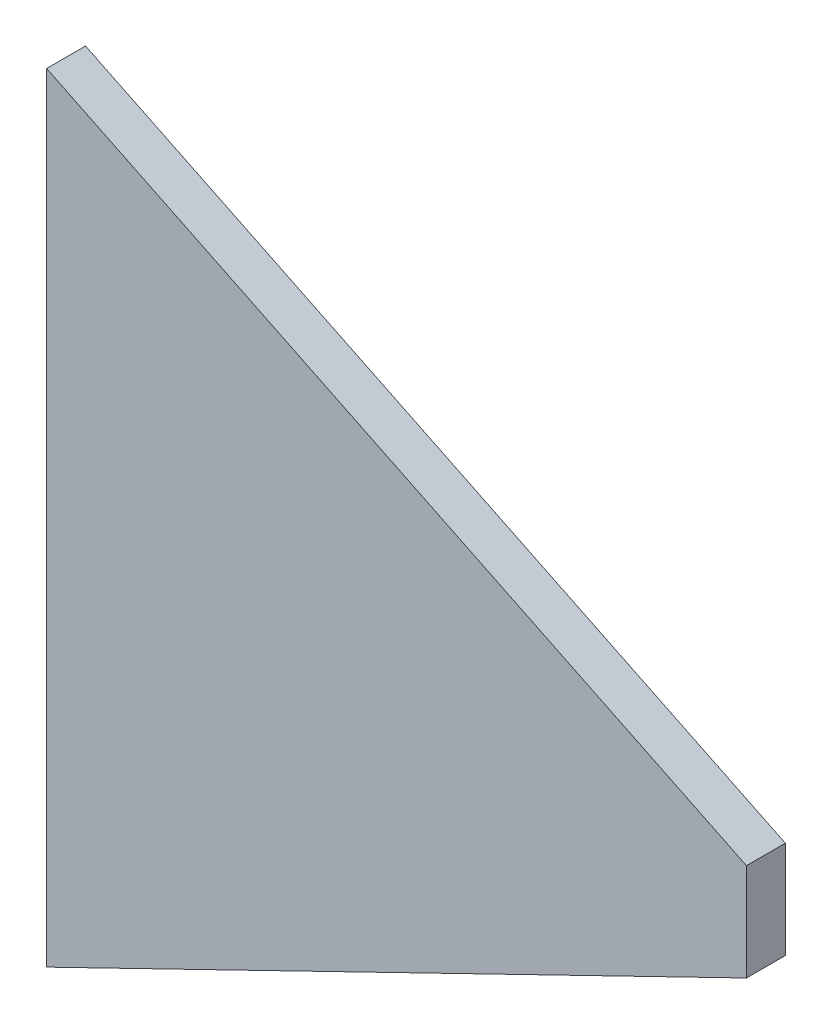
ISO-10303-21;
HEADER;
FILE_DESCRIPTION(('STEP AP214'),'2;1');
FILE_NAME('part.step','',(''),(''),'','','');
FILE_SCHEMA(('AUTOMOTIVE_DESIGN { 1 0 10303 214 1 1 1 1 }'));
ENDSEC;
DATA;
#1=APPLICATION_CONTEXT('core data for automotive mechanical design processes');
#2=APPLICATION_PROTOCOL_DEFINITION('international standard','automotive_design',2000,#1);
#3=PRODUCT_CONTEXT('',#1,'mechanical');
#4=PRODUCT('Part','Part','',(#3));
#5=PRODUCT_RELATED_PRODUCT_CATEGORY('part','',(#4));
#6=PRODUCT_DEFINITION_FORMATION('','',#4);
#7=PRODUCT_DEFINITION_CONTEXT('part definition',#1,'design');
#8=PRODUCT_DEFINITION('design','',#6,#7);
#9=PRODUCT_DEFINITION_SHAPE('','',#8);
#10=(LENGTH_UNIT() NAMED_UNIT(*) SI_UNIT(.MILLI.,.METRE.));
#11=(NAMED_UNIT(*) PLANE_ANGLE_UNIT() SI_UNIT($,.RADIAN.));
#12=(NAMED_UNIT(*) SI_UNIT($,.STERADIAN.) SOLID_ANGLE_UNIT());
#13=UNCERTAINTY_MEASURE_WITH_UNIT(LENGTH_MEASURE(1.E-05),#10,'distance_accuracy_value','');
#14=(GEOMETRIC_REPRESENTATION_CONTEXT(3) GLOBAL_UNCERTAINTY_ASSIGNED_CONTEXT((#13)) GLOBAL_UNIT_ASSIGNED_CONTEXT((#10,
#11,#12)) REPRESENTATION_CONTEXT('',''));
#15=CARTESIAN_POINT('',(0.,0.,0.));
#16=DIRECTION('',(0.,0.,1.));
#17=DIRECTION('',(1.,0.,0.));
#18=AXIS2_PLACEMENT_3D('',#15,#16,#17);
#19=CARTESIAN_POINT('',(-22.8401476297768,-11.1125,1.27));
#20=DIRECTION('',(-0.4375,0.899218410621135,0.));
#21=DIRECTION('',(-0.899218410621135,-0.4375,0.));
#22=AXIS2_PLACEMENT_3D('',#19,#20,#21);
#23=PLANE('',#22);
#24=DIRECTION('',(0.899218410621135,0.4375,0.));
#25=VECTOR('',#24,1.);
#26=CARTESIAN_POINT('',(-22.8401476297768,-11.1125,0.));
#27=LINE('',#26,#25);
#28=CARTESIAN_POINT('',(-22.8401476297768,-11.1125,0.));
#29=VERTEX_POINT('',#28);
#30=CARTESIAN_POINT('',(0.,0.,0.));
#31=VERTEX_POINT('',#30);
#32=EDGE_CURVE('E96',#29,#31,#27,.T.);
#33=ORIENTED_EDGE('',*,*,#32,.T.);
#34=DIRECTION('',(0.,0.,-1.));
#35=VECTOR('',#34,1.);
#36=CARTESIAN_POINT('',(0.,0.,1.27));
#37=LINE('',#36,#35);
#38=CARTESIAN_POINT('',(0.,0.,1.27));
#39=VERTEX_POINT('',#38);
#40=EDGE_CURVE('E11',#39,#31,#37,.T.);
#41=ORIENTED_EDGE('',*,*,#40,.F.);
#42=DIRECTION('',(0.899218410621135,0.4375,0.));
#43=VECTOR('',#42,1.);
#44=CARTESIAN_POINT('',(-22.8401476297768,-11.1125,1.27));
#45=LINE('',#44,#43);
#46=CARTESIAN_POINT('',(-22.8401476297768,-11.1125,1.27));
#47=VERTEX_POINT('',#46);
#48=EDGE_CURVE('E84',#47,#39,#45,.T.);
#49=ORIENTED_EDGE('',*,*,#48,.F.);
#50=DIRECTION('',(0.,0.,-1.));
#51=VECTOR('',#50,1.);
#52=CARTESIAN_POINT('',(-22.8401476297768,-11.1125,1.27));
#53=LINE('',#52,#51);
#54=EDGE_CURVE('E92',#47,#29,#53,.T.);
#55=ORIENTED_EDGE('',*,*,#54,.T.);
#56=EDGE_LOOP('',(#33,#41,#49,#55));
#57=FACE_BOUND('',#56,.T.);
#58=ADVANCED_FACE('F33',(#57),#23,.F.);
#59=CARTESIAN_POINT('',(0.,0.,1.27));
#60=DIRECTION('',(-1.,0.,0.));
#61=DIRECTION('',(0.,0.,1.));
#62=AXIS2_PLACEMENT_3D('',#59,#60,#61);
#63=PLANE('',#62);
#64=DIRECTION('',(0.,1.,0.));
#65=VECTOR('',#64,1.);
#66=CARTESIAN_POINT('',(0.,0.,0.));
#67=LINE('',#66,#65);
#68=CARTESIAN_POINT('',(0.,3.175,0.));
#69=VERTEX_POINT('',#68);
#70=EDGE_CURVE('E88',#31,#69,#67,.T.);
#71=ORIENTED_EDGE('',*,*,#70,.T.);
#72=DIRECTION('',(0.,0.,-1.));
#73=VECTOR('',#72,1.);
#74=CARTESIAN_POINT('',(0.,3.175,1.27));
#75=LINE('',#74,#73);
#76=CARTESIAN_POINT('',(0.,3.175,1.27));
#77=VERTEX_POINT('',#76);
#78=EDGE_CURVE('E41',#77,#69,#75,.T.);
#79=ORIENTED_EDGE('',*,*,#78,.F.);
#80=DIRECTION('',(0.,1.,0.));
#81=VECTOR('',#80,1.);
#82=CARTESIAN_POINT('',(0.,0.,1.27));
#83=LINE('',#82,#81);
#84=EDGE_CURVE('E79',#39,#77,#83,.T.);
#85=ORIENTED_EDGE('',*,*,#84,.F.);
#86=ORIENTED_EDGE('',*,*,#40,.T.);
#87=EDGE_LOOP('',(#71,#79,#85,#86));
#88=FACE_BOUND('',#87,.T.);
#89=ADVANCED_FACE('F87',(#88),#63,.F.);
#90=CARTESIAN_POINT('',(0.,3.175,1.27));
#91=DIRECTION('',(-0.4375,-0.899218410621135,0.));
#92=DIRECTION('',(0.899218410621135,-0.4375,0.));
#93=AXIS2_PLACEMENT_3D('',#90,#91,#92);
#94=PLANE('',#93);
#95=DIRECTION('',(-0.899218410621135,0.4375,0.));
#96=VECTOR('',#95,1.);
#97=CARTESIAN_POINT('',(0.,3.175,0.));
#98=LINE('',#97,#96);
#99=CARTESIAN_POINT('',(-22.8401476297768,14.2875,0.));
#100=VERTEX_POINT('',#99);
#101=EDGE_CURVE('E66',#69,#100,#98,.T.);
#102=ORIENTED_EDGE('',*,*,#101,.T.);
#103=DIRECTION('',(0.,0.,-1.));
#104=VECTOR('',#103,1.);
#105=CARTESIAN_POINT('',(-22.8401476297768,14.2875,1.27));
#106=LINE('',#105,#104);
#107=CARTESIAN_POINT('',(-22.8401476297768,14.2875,1.27));
#108=VERTEX_POINT('',#107);
#109=EDGE_CURVE('E89',#108,#100,#106,.T.);
#110=ORIENTED_EDGE('',*,*,#109,.F.);
#111=DIRECTION('',(-0.899218410621135,0.4375,0.));
#112=VECTOR('',#111,1.);
#113=CARTESIAN_POINT('',(0.,3.175,1.27));
#114=LINE('',#113,#112);
#115=EDGE_CURVE('E82',#77,#108,#114,.T.);
#116=ORIENTED_EDGE('',*,*,#115,.F.);
#117=ORIENTED_EDGE('',*,*,#78,.T.);
#118=EDGE_LOOP('',(#102,#110,#116,#117));
#119=FACE_BOUND('',#118,.T.);
#120=ADVANCED_FACE('F90',(#119),#94,.F.);
#121=CARTESIAN_POINT('',(-22.8401476297768,14.2875,1.27));
#122=DIRECTION('',(1.,0.,0.));
#123=DIRECTION('',(0.,1.,0.));
#124=AXIS2_PLACEMENT_3D('',#121,#122,#123);
#125=PLANE('',#124);
#126=DIRECTION('',(0.,-1.,0.));
#127=VECTOR('',#126,1.);
#128=CARTESIAN_POINT('',(-22.8401476297768,14.2875,0.));
#129=LINE('',#128,#127);
#130=EDGE_CURVE('E72',#100,#29,#129,.T.);
#131=ORIENTED_EDGE('',*,*,#130,.T.);
#132=ORIENTED_EDGE('',*,*,#54,.F.);
#133=DIRECTION('',(0.,-1.,0.));
#134=VECTOR('',#133,1.);
#135=CARTESIAN_POINT('',(-22.8401476297768,14.2875,1.27));
#136=LINE('',#135,#134);
#137=EDGE_CURVE('E49',#108,#47,#136,.T.);
#138=ORIENTED_EDGE('',*,*,#137,.F.);
#139=ORIENTED_EDGE('',*,*,#109,.T.);
#140=EDGE_LOOP('',(#131,#132,#138,#139));
#141=FACE_BOUND('',#140,.T.);
#142=ADVANCED_FACE('F103',(#141),#125,.F.);
#143=CARTESIAN_POINT('',(0.,0.,1.27));
#144=DIRECTION('',(0.,0.,1.));
#145=DIRECTION('',(1.,0.,0.));
#146=AXIS2_PLACEMENT_3D('',#143,#144,#145);
#147=PLANE('',#146);
#148=ORIENTED_EDGE('',*,*,#48,.T.);
#149=ORIENTED_EDGE('',*,*,#84,.T.);
#150=ORIENTED_EDGE('',*,*,#115,.T.);
#151=ORIENTED_EDGE('',*,*,#137,.T.);
#152=EDGE_LOOP('',(#148,#149,#150,#151));
#153=FACE_BOUND('',#152,.T.);
#154=ADVANCED_FACE('F80',(#153),#147,.T.);
#155=CARTESIAN_POINT('',(0.,0.,0.));
#156=DIRECTION('',(0.,0.,1.));
#157=DIRECTION('',(1.,0.,0.));
#158=AXIS2_PLACEMENT_3D('',#155,#156,#157);
#159=PLANE('',#158);
#160=ORIENTED_EDGE('',*,*,#32,.F.);
#161=ORIENTED_EDGE('',*,*,#130,.F.);
#162=ORIENTED_EDGE('',*,*,#101,.F.);
#163=ORIENTED_EDGE('',*,*,#70,.F.);
#164=EDGE_LOOP('',(#160,#161,#162,#163));
#165=FACE_BOUND('',#164,.T.);
#166=ADVANCED_FACE('F106',(#165),#159,.F.);
#167=CLOSED_SHELL('',(#58,#89,#120,#142,#154,#166));
#168=MANIFOLD_SOLID_BREP('B2',#167);
#169=ADVANCED_BREP_SHAPE_REPRESENTATION('',(#18,#168),#14);
#170=SHAPE_DEFINITION_REPRESENTATION(#9,#169);
ENDSEC;
END-ISO-10303-21;
